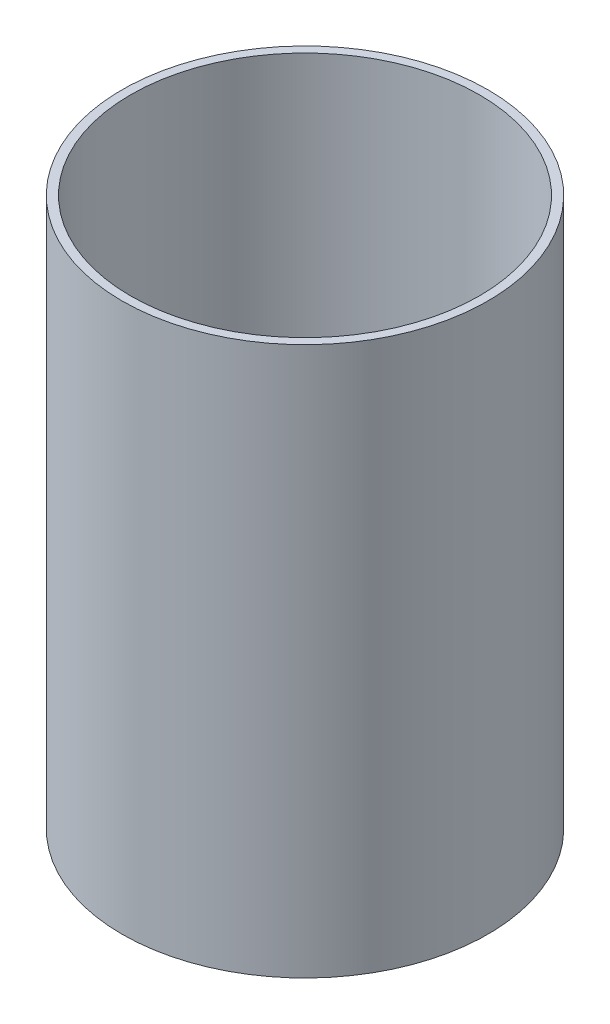
ISO-10303-21;
HEADER;
FILE_DESCRIPTION(('STEP AP214'),'2;1');
FILE_NAME('part.step','',(''),(''),'','','');
FILE_SCHEMA(('AUTOMOTIVE_DESIGN { 1 0 10303 214 1 1 1 1 }'));
ENDSEC;
DATA;
#1=APPLICATION_CONTEXT('core data for automotive mechanical design processes');
#2=APPLICATION_PROTOCOL_DEFINITION('international standard','automotive_design',2000,#1);
#3=PRODUCT_CONTEXT('',#1,'mechanical');
#4=PRODUCT('Part','Part','',(#3));
#5=PRODUCT_RELATED_PRODUCT_CATEGORY('part','',(#4));
#6=PRODUCT_DEFINITION_FORMATION('','',#4);
#7=PRODUCT_DEFINITION_CONTEXT('part definition',#1,'design');
#8=PRODUCT_DEFINITION('design','',#6,#7);
#9=PRODUCT_DEFINITION_SHAPE('','',#8);
#10=(LENGTH_UNIT() NAMED_UNIT(*) SI_UNIT(.MILLI.,.METRE.));
#11=(NAMED_UNIT(*) PLANE_ANGLE_UNIT() SI_UNIT($,.RADIAN.));
#12=(NAMED_UNIT(*) SI_UNIT($,.STERADIAN.) SOLID_ANGLE_UNIT());
#13=UNCERTAINTY_MEASURE_WITH_UNIT(LENGTH_MEASURE(1.E-05),#10,'distance_accuracy_value','');
#14=(GEOMETRIC_REPRESENTATION_CONTEXT(3) GLOBAL_UNCERTAINTY_ASSIGNED_CONTEXT((#13)) GLOBAL_UNIT_ASSIGNED_CONTEXT((#10,
#11,#12)) REPRESENTATION_CONTEXT('',''));
#15=CARTESIAN_POINT('',(0.,0.,0.));
#16=DIRECTION('',(0.,0.,1.));
#17=DIRECTION('',(1.,0.,0.));
#18=AXIS2_PLACEMENT_3D('',#15,#16,#17);
#19=CARTESIAN_POINT('',(0.,254.85,0.));
#20=DIRECTION('',(0.,1.,0.));
#21=DIRECTION('',(0.,0.,1.));
#22=AXIS2_PLACEMENT_3D('',#19,#20,#21);
#23=PLANE('',#22);
#24=CARTESIAN_POINT('',(0.,254.85,0.));
#25=DIRECTION('',(0.,1.,0.));
#26=DIRECTION('',(0.,0.,1.));
#27=AXIS2_PLACEMENT_3D('',#24,#25,#26);
#28=CIRCLE('',#27,85.);
#29=CARTESIAN_POINT('',(0.,254.85,85.));
#30=VERTEX_POINT('',#29);
#31=EDGE_CURVE('E10',#30,#30,#28,.T.);
#32=ORIENTED_EDGE('',*,*,#31,.T.);
#33=EDGE_LOOP('',(#32));
#34=FACE_BOUND('',#33,.T.);
#35=CARTESIAN_POINT('',(0.,254.85,0.));
#36=DIRECTION('',(0.,1.,0.));
#37=DIRECTION('',(0.,0.,1.));
#38=AXIS2_PLACEMENT_3D('',#35,#36,#37);
#39=CIRCLE('',#38,81.);
#40=CARTESIAN_POINT('',(0.,254.85,81.));
#41=VERTEX_POINT('',#40);
#42=EDGE_CURVE('E56',#41,#41,#39,.T.);
#43=ORIENTED_EDGE('',*,*,#42,.F.);
#44=EDGE_LOOP('',(#43));
#45=FACE_BOUND('',#44,.T.);
#46=ADVANCED_FACE('F43',(#34,#45),#23,.T.);
#47=CARTESIAN_POINT('',(0.,0.,0.));
#48=DIRECTION('',(0.,1.,0.));
#49=DIRECTION('',(0.,0.,1.));
#50=AXIS2_PLACEMENT_3D('',#47,#48,#49);
#51=PLANE('',#50);
#52=CARTESIAN_POINT('',(0.,0.,0.));
#53=DIRECTION('',(0.,1.,0.));
#54=DIRECTION('',(0.,0.,1.));
#55=AXIS2_PLACEMENT_3D('',#52,#53,#54);
#56=CIRCLE('',#55,85.);
#57=CARTESIAN_POINT('',(0.,0.,85.));
#58=VERTEX_POINT('',#57);
#59=EDGE_CURVE('E47',#58,#58,#56,.T.);
#60=ORIENTED_EDGE('',*,*,#59,.F.);
#61=EDGE_LOOP('',(#60));
#62=FACE_BOUND('',#61,.T.);
#63=CARTESIAN_POINT('',(0.,0.,0.));
#64=DIRECTION('',(0.,1.,0.));
#65=DIRECTION('',(0.,0.,1.));
#66=AXIS2_PLACEMENT_3D('',#63,#64,#65);
#67=CIRCLE('',#66,81.);
#68=CARTESIAN_POINT('',(0.,0.,81.));
#69=VERTEX_POINT('',#68);
#70=EDGE_CURVE('E58',#69,#69,#67,.T.);
#71=ORIENTED_EDGE('',*,*,#70,.T.);
#72=EDGE_LOOP('',(#71));
#73=FACE_BOUND('',#72,.T.);
#74=ADVANCED_FACE('F70',(#62,#73),#51,.F.);
#75=CARTESIAN_POINT('',(0.,254.85,0.));
#76=DIRECTION('',(0.,-1.,0.));
#77=DIRECTION('',(0.,0.,-1.));
#78=AXIS2_PLACEMENT_3D('',#75,#76,#77);
#79=CYLINDRICAL_SURFACE('',#78,85.);
#80=ORIENTED_EDGE('',*,*,#31,.F.);
#81=EDGE_LOOP('',(#80));
#82=FACE_BOUND('',#81,.T.);
#83=ORIENTED_EDGE('',*,*,#59,.T.);
#84=EDGE_LOOP('',(#83));
#85=FACE_BOUND('',#84,.T.);
#86=ADVANCED_FACE('F45',(#82,#85),#79,.T.);
#87=CARTESIAN_POINT('',(0.,254.85,0.));
#88=DIRECTION('',(0.,-1.,0.));
#89=DIRECTION('',(0.,0.,-1.));
#90=AXIS2_PLACEMENT_3D('',#87,#88,#89);
#91=CYLINDRICAL_SURFACE('',#90,81.);
#92=ORIENTED_EDGE('',*,*,#42,.T.);
#93=EDGE_LOOP('',(#92));
#94=FACE_BOUND('',#93,.T.);
#95=ORIENTED_EDGE('',*,*,#70,.F.);
#96=EDGE_LOOP('',(#95));
#97=FACE_BOUND('',#96,.T.);
#98=ADVANCED_FACE('F66',(#94,#97),#91,.F.);
#99=CLOSED_SHELL('',(#46,#74,#86,#98));
#100=MANIFOLD_SOLID_BREP('B2',#99);
#101=ADVANCED_BREP_SHAPE_REPRESENTATION('',(#18,#100),#14);
#102=SHAPE_DEFINITION_REPRESENTATION(#9,#101);
ENDSEC;
END-ISO-10303-21;
